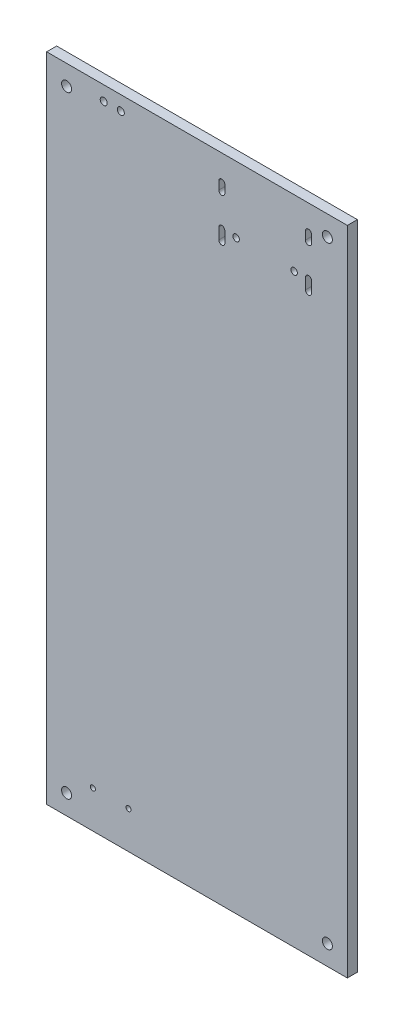
ISO-10303-21;
HEADER;
FILE_DESCRIPTION(('STEP AP214'),'2;1');
FILE_NAME('part.step','',(''),(''),'','','');
FILE_SCHEMA(('AUTOMOTIVE_DESIGN { 1 0 10303 214 1 1 1 1 }'));
ENDSEC;
DATA;
#1=APPLICATION_CONTEXT('core data for automotive mechanical design processes');
#2=APPLICATION_PROTOCOL_DEFINITION('international standard','automotive_design',2000,#1);
#3=PRODUCT_CONTEXT('',#1,'mechanical');
#4=PRODUCT('Part','Part','',(#3));
#5=PRODUCT_RELATED_PRODUCT_CATEGORY('part','',(#4));
#6=PRODUCT_DEFINITION_FORMATION('','',#4);
#7=PRODUCT_DEFINITION_CONTEXT('part definition',#1,'design');
#8=PRODUCT_DEFINITION('design','',#6,#7);
#9=PRODUCT_DEFINITION_SHAPE('','',#8);
#10=(LENGTH_UNIT() NAMED_UNIT(*) SI_UNIT(.MILLI.,.METRE.));
#11=(NAMED_UNIT(*) PLANE_ANGLE_UNIT() SI_UNIT($,.RADIAN.));
#12=(NAMED_UNIT(*) SI_UNIT($,.STERADIAN.) SOLID_ANGLE_UNIT());
#13=UNCERTAINTY_MEASURE_WITH_UNIT(LENGTH_MEASURE(1.E-05),#10,'distance_accuracy_value','');
#14=(GEOMETRIC_REPRESENTATION_CONTEXT(3) GLOBAL_UNCERTAINTY_ASSIGNED_CONTEXT((#13)) GLOBAL_UNIT_ASSIGNED_CONTEXT((#10,
#11,#12)) REPRESENTATION_CONTEXT('',''));
#15=CARTESIAN_POINT('',(0.,0.,0.));
#16=DIRECTION('',(0.,0.,1.));
#17=DIRECTION('',(1.,0.,0.));
#18=AXIS2_PLACEMENT_3D('',#15,#16,#17);
#19=CARTESIAN_POINT('',(15.050830581661,-32.50006477013,0.));
#20=DIRECTION('',(0.,0.,-1.));
#21=DIRECTION('',(-1.,0.,0.));
#22=AXIS2_PLACEMENT_3D('',#19,#20,#21);
#23=PLANE('',#22);
#24=CARTESIAN_POINT('',(28.050855981712,-63.00012700025,0.));
#25=DIRECTION('',(0.,0.,-1.));
#26=DIRECTION('',(-1.,0.,0.));
#27=AXIS2_PLACEMENT_3D('',#24,#25,#26);
#28=CIRCLE('',#27,0.5);
#29=CARTESIAN_POINT('',(27.550855981712,-63.00012700025,0.));
#30=VERTEX_POINT('',#29);
#31=EDGE_CURVE('E269',#30,#30,#28,.F.);
#32=ORIENTED_EDGE('',*,*,#31,.T.);
#33=EDGE_LOOP('',(#32));
#34=FACE_BOUND('',#33,.T.);
#35=CARTESIAN_POINT('',(28.050855981712,-2.00000508001,0.));
#36=DIRECTION('',(0.,0.,-1.));
#37=DIRECTION('',(-1.,0.,0.));
#38=AXIS2_PLACEMENT_3D('',#35,#36,#37);
#39=CIRCLE('',#38,0.5);
#40=CARTESIAN_POINT('',(27.550855981712,-2.00000508001,0.));
#41=VERTEX_POINT('',#40);
#42=EDGE_CURVE('E272',#41,#41,#39,.F.);
#43=ORIENTED_EDGE('',*,*,#42,.T.);
#44=EDGE_LOOP('',(#43));
#45=FACE_BOUND('',#44,.T.);
#46=DIRECTION('',(0.,1.,0.));
#47=VECTOR('',#46,1.);
#48=CARTESIAN_POINT('',(25.864084328169,-6.571399542799,0.));
#49=LINE('',#48,#47);
#50=CARTESIAN_POINT('',(25.864084328169,-7.67142494285,0.));
#51=VERTEX_POINT('',#50);
#52=CARTESIAN_POINT('',(25.864084328169,-6.571399542799,0.));
#53=VERTEX_POINT('',#52);
#54=EDGE_CURVE('E176',#51,#53,#49,.T.);
#55=ORIENTED_EDGE('',*,*,#54,.F.);
#56=CARTESIAN_POINT('',(26.164084328169,-7.67142494285,0.));
#57=DIRECTION('',(0.,0.,-1.));
#58=DIRECTION('',(-1.,0.,0.));
#59=AXIS2_PLACEMENT_3D('',#56,#57,#58);
#60=CIRCLE('',#59,0.3);
#61=CARTESIAN_POINT('',(26.464084328169,-7.67142494285,0.));
#62=VERTEX_POINT('',#61);
#63=EDGE_CURVE('E179',#51,#62,#60,.F.);
#64=ORIENTED_EDGE('',*,*,#63,.T.);
#65=DIRECTION('',(0.,1.,0.));
#66=VECTOR('',#65,1.);
#67=CARTESIAN_POINT('',(26.464084328169,-7.67142494285,0.));
#68=LINE('',#67,#66);
#69=CARTESIAN_POINT('',(26.464084328169,-6.571399542799,0.));
#70=VERTEX_POINT('',#69);
#71=EDGE_CURVE('E181',#70,#62,#68,.F.);
#72=ORIENTED_EDGE('',*,*,#71,.F.);
#73=CARTESIAN_POINT('',(26.164084328169,-6.571399542799,0.));
#74=DIRECTION('',(0.,0.,-1.));
#75=DIRECTION('',(-1.,0.,0.));
#76=AXIS2_PLACEMENT_3D('',#73,#74,#75);
#77=CIRCLE('',#76,0.3);
#78=EDGE_CURVE('E183',#70,#53,#77,.F.);
#79=ORIENTED_EDGE('',*,*,#78,.T.);
#80=EDGE_LOOP('',(#55,#64,#72,#79));
#81=FACE_BOUND('',#80,.T.);
#82=DIRECTION('',(0.,1.,0.));
#83=VECTOR('',#82,1.);
#84=CARTESIAN_POINT('',(25.864084328169,-2.571551943104,0.));
#85=LINE('',#84,#83);
#86=CARTESIAN_POINT('',(25.864084328169,-3.371551943104,0.));
#87=VERTEX_POINT('',#86);
#88=CARTESIAN_POINT('',(25.864084328169,-2.571551943104,0.));
#89=VERTEX_POINT('',#88);
#90=EDGE_CURVE('E185',#87,#89,#85,.T.);
#91=ORIENTED_EDGE('',*,*,#90,.F.);
#92=CARTESIAN_POINT('',(26.164084328169,-3.371551943104,0.));
#93=DIRECTION('',(0.,0.,-1.));
#94=DIRECTION('',(-1.,0.,0.));
#95=AXIS2_PLACEMENT_3D('',#92,#93,#94);
#96=CIRCLE('',#95,0.3);
#97=CARTESIAN_POINT('',(26.464084328169,-3.371551943104,0.));
#98=VERTEX_POINT('',#97);
#99=EDGE_CURVE('E188',#87,#98,#96,.F.);
#100=ORIENTED_EDGE('',*,*,#99,.T.);
#101=DIRECTION('',(0.,1.,0.));
#102=VECTOR('',#101,1.);
#103=CARTESIAN_POINT('',(26.464084328169,-3.371551943104,0.));
#104=LINE('',#103,#102);
#105=CARTESIAN_POINT('',(26.464084328169,-2.571551943104,0.));
#106=VERTEX_POINT('',#105);
#107=EDGE_CURVE('E190',#106,#98,#104,.F.);
#108=ORIENTED_EDGE('',*,*,#107,.F.);
#109=CARTESIAN_POINT('',(26.164084328169,-2.571551943104,0.));
#110=DIRECTION('',(0.,0.,-1.));
#111=DIRECTION('',(-1.,0.,0.));
#112=AXIS2_PLACEMENT_3D('',#109,#110,#111);
#113=CIRCLE('',#112,0.3);
#114=EDGE_CURVE('E192',#106,#89,#113,.F.);
#115=ORIENTED_EDGE('',*,*,#114,.T.);
#116=EDGE_LOOP('',(#91,#100,#108,#115));
#117=FACE_BOUND('',#116,.T.);
#118=CARTESIAN_POINT('',(24.734061468123,-6.622047244094,0.));
#119=DIRECTION('',(0.,0.,-1.));
#120=DIRECTION('',(-1.,0.,0.));
#121=AXIS2_PLACEMENT_3D('',#118,#119,#120);
#122=CIRCLE('',#121,0.324993649987);
#123=CARTESIAN_POINT('',(24.409067818136,-6.622047244094,0.));
#124=VERTEX_POINT('',#123);
#125=EDGE_CURVE('E193',#124,#124,#122,.F.);
#126=ORIENTED_EDGE('',*,*,#125,.T.);
#127=EDGE_LOOP('',(#126));
#128=FACE_BOUND('',#127,.T.);
#129=CARTESIAN_POINT('',(18.954025908052,-6.622047244094,0.));
#130=DIRECTION('',(0.,0.,-1.));
#131=DIRECTION('',(-1.,0.,0.));
#132=AXIS2_PLACEMENT_3D('',#129,#130,#131);
#133=CIRCLE('',#132,0.324993649987);
#134=CARTESIAN_POINT('',(18.629032258065,-6.622047244094,0.));
#135=VERTEX_POINT('',#134);
#136=EDGE_CURVE('E287',#135,#135,#133,.F.);
#137=ORIENTED_EDGE('',*,*,#136,.T.);
#138=EDGE_LOOP('',(#137));
#139=FACE_BOUND('',#138,.T.);
#140=DIRECTION('',(0.,1.,0.));
#141=VECTOR('',#140,1.);
#142=CARTESIAN_POINT('',(17.224003048006,-6.571399542799,0.));
#143=LINE('',#142,#141);
#144=CARTESIAN_POINT('',(17.224003048006,-7.67142494285,0.));
#145=VERTEX_POINT('',#144);
#146=CARTESIAN_POINT('',(17.224003048006,-6.571399542799,0.));
#147=VERTEX_POINT('',#146);
#148=EDGE_CURVE('E194',#145,#147,#143,.T.);
#149=ORIENTED_EDGE('',*,*,#148,.F.);
#150=CARTESIAN_POINT('',(17.524003048006,-7.67142494285,0.));
#151=DIRECTION('',(0.,0.,-1.));
#152=DIRECTION('',(-1.,0.,0.));
#153=AXIS2_PLACEMENT_3D('',#150,#151,#152);
#154=CIRCLE('',#153,0.3);
#155=CARTESIAN_POINT('',(17.824003048006,-7.67142494285,0.));
#156=VERTEX_POINT('',#155);
#157=EDGE_CURVE('E197',#145,#156,#154,.F.);
#158=ORIENTED_EDGE('',*,*,#157,.T.);
#159=DIRECTION('',(0.,1.,0.));
#160=VECTOR('',#159,1.);
#161=CARTESIAN_POINT('',(17.824003048006,-7.67142494285,0.));
#162=LINE('',#161,#160);
#163=CARTESIAN_POINT('',(17.824003048006,-6.571399542799,0.));
#164=VERTEX_POINT('',#163);
#165=EDGE_CURVE('E199',#164,#156,#162,.F.);
#166=ORIENTED_EDGE('',*,*,#165,.F.);
#167=CARTESIAN_POINT('',(17.524003048006,-6.571399542799,0.));
#168=DIRECTION('',(0.,0.,-1.));
#169=DIRECTION('',(-1.,0.,0.));
#170=AXIS2_PLACEMENT_3D('',#167,#168,#169);
#171=CIRCLE('',#170,0.3);
#172=EDGE_CURVE('E201',#164,#147,#171,.F.);
#173=ORIENTED_EDGE('',*,*,#172,.T.);
#174=EDGE_LOOP('',(#149,#158,#166,#173));
#175=FACE_BOUND('',#174,.T.);
#176=DIRECTION('',(0.,1.,0.));
#177=VECTOR('',#176,1.);
#178=CARTESIAN_POINT('',(17.224003048006,-2.571551943104,0.));
#179=LINE('',#178,#177);
#180=CARTESIAN_POINT('',(17.224003048006,-3.371551943104,0.));
#181=VERTEX_POINT('',#180);
#182=CARTESIAN_POINT('',(17.224003048006,-2.571551943104,0.));
#183=VERTEX_POINT('',#182);
#184=EDGE_CURVE('E203',#181,#183,#179,.T.);
#185=ORIENTED_EDGE('',*,*,#184,.F.);
#186=CARTESIAN_POINT('',(17.524003048006,-3.371551943104,0.));
#187=DIRECTION('',(0.,0.,-1.));
#188=DIRECTION('',(-1.,0.,0.));
#189=AXIS2_PLACEMENT_3D('',#186,#187,#188);
#190=CIRCLE('',#189,0.3);
#191=CARTESIAN_POINT('',(17.824003048006,-3.371551943104,0.));
#192=VERTEX_POINT('',#191);
#193=EDGE_CURVE('E206',#181,#192,#190,.F.);
#194=ORIENTED_EDGE('',*,*,#193,.T.);
#195=DIRECTION('',(0.,1.,0.));
#196=VECTOR('',#195,1.);
#197=CARTESIAN_POINT('',(17.824003048006,-3.371551943104,0.));
#198=LINE('',#197,#196);
#199=CARTESIAN_POINT('',(17.824003048006,-2.571551943104,0.));
#200=VERTEX_POINT('',#199);
#201=EDGE_CURVE('E208',#200,#192,#198,.F.);
#202=ORIENTED_EDGE('',*,*,#201,.F.);
#203=CARTESIAN_POINT('',(17.524003048006,-2.571551943104,0.));
#204=DIRECTION('',(0.,0.,-1.));
#205=DIRECTION('',(-1.,0.,0.));
#206=AXIS2_PLACEMENT_3D('',#203,#204,#205);
#207=CIRCLE('',#206,0.3);
#208=EDGE_CURVE('E133',#200,#183,#207,.F.);
#209=ORIENTED_EDGE('',*,*,#208,.T.);
#210=EDGE_LOOP('',(#185,#194,#202,#209));
#211=FACE_BOUND('',#210,.T.);
#212=CARTESIAN_POINT('',(8.229616459233,-61.26492252984,0.));
#213=DIRECTION('',(0.,0.,-1.));
#214=DIRECTION('',(-1.,0.,0.));
#215=AXIS2_PLACEMENT_3D('',#212,#213,#214);
#216=CIRCLE('',#215,0.25);
#217=CARTESIAN_POINT('',(7.979616459233,-61.26492252984,0.));
#218=VERTEX_POINT('',#217);
#219=EDGE_CURVE('E209',#218,#218,#216,.F.);
#220=ORIENTED_EDGE('',*,*,#219,.T.);
#221=EDGE_LOOP('',(#220));
#222=FACE_BOUND('',#221,.T.);
#223=CARTESIAN_POINT('',(7.454152908306,-1.44475488951,0.));
#224=DIRECTION('',(0.,0.,-1.));
#225=DIRECTION('',(-1.,0.,0.));
#226=AXIS2_PLACEMENT_3D('',#223,#224,#225);
#227=CIRCLE('',#226,0.350012700025);
#228=CARTESIAN_POINT('',(7.104140208281,-1.44475488951,0.));
#229=VERTEX_POINT('',#228);
#230=EDGE_CURVE('E303',#229,#229,#227,.F.);
#231=ORIENTED_EDGE('',*,*,#230,.T.);
#232=EDGE_LOOP('',(#231));
#233=FACE_BOUND('',#232,.T.);
#234=CARTESIAN_POINT('',(5.754127508255,-1.44475488951,0.));
#235=DIRECTION('',(0.,0.,-1.));
#236=DIRECTION('',(-1.,0.,0.));
#237=AXIS2_PLACEMENT_3D('',#234,#235,#236);
#238=CIRCLE('',#237,0.350012700025);
#239=CARTESIAN_POINT('',(5.40411480823,-1.44475488951,0.));
#240=VERTEX_POINT('',#239);
#241=EDGE_CURVE('E306',#240,#240,#238,.F.);
#242=ORIENTED_EDGE('',*,*,#241,.T.);
#243=EDGE_LOOP('',(#242));
#244=FACE_BOUND('',#243,.T.);
#245=CARTESIAN_POINT('',(4.673609347219,-61.26492252984,0.));
#246=DIRECTION('',(0.,0.,-1.));
#247=DIRECTION('',(-1.,0.,0.));
#248=AXIS2_PLACEMENT_3D('',#245,#246,#247);
#249=CIRCLE('',#248,0.25);
#250=CARTESIAN_POINT('',(4.423609347219,-61.26492252984,0.));
#251=VERTEX_POINT('',#250);
#252=EDGE_CURVE('E309',#251,#251,#249,.F.);
#253=ORIENTED_EDGE('',*,*,#252,.T.);
#254=EDGE_LOOP('',(#253));
#255=FACE_BOUND('',#254,.T.);
#256=CARTESIAN_POINT('',(2.05080518161,-2.00000508001,0.));
#257=DIRECTION('',(0.,0.,-1.));
#258=DIRECTION('',(-1.,0.,0.));
#259=AXIS2_PLACEMENT_3D('',#256,#257,#258);
#260=CIRCLE('',#259,0.5);
#261=CARTESIAN_POINT('',(1.55080518161,-2.00000508001,0.));
#262=VERTEX_POINT('',#261);
#263=EDGE_CURVE('E311',#262,#262,#260,.F.);
#264=ORIENTED_EDGE('',*,*,#263,.T.);
#265=EDGE_LOOP('',(#264));
#266=FACE_BOUND('',#265,.T.);
#267=CARTESIAN_POINT('',(2.05080518161,-63.00012700025,0.));
#268=DIRECTION('',(0.,0.,-1.));
#269=DIRECTION('',(-1.,0.,0.));
#270=AXIS2_PLACEMENT_3D('',#267,#268,#269);
#271=CIRCLE('',#270,0.5);
#272=CARTESIAN_POINT('',(1.55080518161,-63.00012700025,0.));
#273=VERTEX_POINT('',#272);
#274=EDGE_CURVE('E20',#273,#273,#271,.F.);
#275=ORIENTED_EDGE('',*,*,#274,.T.);
#276=EDGE_LOOP('',(#275));
#277=FACE_BOUND('',#276,.T.);
#278=DIRECTION('',(1.,0.,0.));
#279=VECTOR('',#278,1.);
#280=CARTESIAN_POINT('',(30.038161036322,-64.98742951485,0.));
#281=LINE('',#280,#279);
#282=CARTESIAN_POINT('',(0.0635001270002508,-64.98742951485,0.));
#283=VERTEX_POINT('',#282);
#284=CARTESIAN_POINT('',(30.038161036322,-64.98742951485,0.));
#285=VERTEX_POINT('',#284);
#286=EDGE_CURVE('E329',#283,#285,#281,.T.);
#287=ORIENTED_EDGE('',*,*,#286,.F.);
#288=DIRECTION('',(0.,-1.,0.));
#289=VECTOR('',#288,1.);
#290=CARTESIAN_POINT('',(0.06350012700025,-64.98742951485,0.));
#291=LINE('',#290,#289);
#292=CARTESIAN_POINT('',(0.0635001270002564,-0.0127000254000488,0.));
#293=VERTEX_POINT('',#292);
#294=EDGE_CURVE('E157',#293,#283,#291,.T.);
#295=ORIENTED_EDGE('',*,*,#294,.F.);
#296=DIRECTION('',(1.,0.,0.));
#297=VECTOR('',#296,1.);
#298=CARTESIAN_POINT('',(0.06350012700026,-0.01270002540005,0.));
#299=LINE('',#298,#297);
#300=CARTESIAN_POINT('',(30.038161036322,-0.0127000254000494,0.));
#301=VERTEX_POINT('',#300);
#302=EDGE_CURVE('E142',#301,#293,#299,.F.);
#303=ORIENTED_EDGE('',*,*,#302,.F.);
#304=DIRECTION('',(0.,1.,0.));
#305=VECTOR('',#304,1.);
#306=CARTESIAN_POINT('',(30.038161036322,-0.01270002540005,0.));
#307=LINE('',#306,#305);
#308=EDGE_CURVE('E153',#285,#301,#307,.T.);
#309=ORIENTED_EDGE('',*,*,#308,.F.);
#310=EDGE_LOOP('',(#287,#295,#303,#309));
#311=FACE_BOUND('',#310,.T.);
#312=ADVANCED_FACE('F17',(#34,#45,#81,#117,#128,#139,#175,#211,#222,#233,#244,#255,#266,#277,
#311),#23,.T.);
#313=CARTESIAN_POINT('',(0.06350012700026,-0.01270002540005,0.));
#314=DIRECTION('',(0.,1.,0.));
#315=DIRECTION('',(0.,0.,1.));
#316=AXIS2_PLACEMENT_3D('',#313,#314,#315);
#317=PLANE('',#316);
#318=DIRECTION('',(0.,0.,1.));
#319=VECTOR('',#318,1.);
#320=CARTESIAN_POINT('',(30.038161036322,-0.01270002540005,0.));
#321=LINE('',#320,#319);
#322=CARTESIAN_POINT('',(30.038161036322,-0.0127000254000494,1.000025400051));
#323=VERTEX_POINT('',#322);
#324=EDGE_CURVE('E158',#301,#323,#321,.T.);
#325=ORIENTED_EDGE('',*,*,#324,.F.);
#326=ORIENTED_EDGE('',*,*,#302,.T.);
#327=DIRECTION('',(0.,0.,1.));
#328=VECTOR('',#327,1.);
#329=CARTESIAN_POINT('',(0.0635001270002558,-0.0127000254000476,0.));
#330=LINE('',#329,#328);
#331=CARTESIAN_POINT('',(0.0635001270002564,-0.0127000254000488,1.000025400051));
#332=VERTEX_POINT('',#331);
#333=EDGE_CURVE('E318',#332,#293,#330,.F.);
#334=ORIENTED_EDGE('',*,*,#333,.F.);
#335=DIRECTION('',(-1.,0.,0.));
#336=VECTOR('',#335,1.);
#337=CARTESIAN_POINT('',(15.050830581661,-0.0127000254000476,1.000025400051));
#338=LINE('',#337,#336);
#339=EDGE_CURVE('E172',#332,#323,#338,.F.);
#340=ORIENTED_EDGE('',*,*,#339,.T.);
#341=EDGE_LOOP('',(#325,#326,#334,#340));
#342=FACE_BOUND('',#341,.T.);
#343=ADVANCED_FACE('F170',(#342),#317,.T.);
#344=CARTESIAN_POINT('',(30.038161036322,-0.01270002540005,0.));
#345=DIRECTION('',(1.,0.,0.));
#346=DIRECTION('',(0.,1.,0.));
#347=AXIS2_PLACEMENT_3D('',#344,#345,#346);
#348=PLANE('',#347);
#349=DIRECTION('',(0.,0.,-1.));
#350=VECTOR('',#349,1.);
#351=CARTESIAN_POINT('',(30.038161036322,-64.98742951485,0.));
#352=LINE('',#351,#350);
#353=CARTESIAN_POINT('',(30.038161036322,-64.98742951485,1.000025400051));
#354=VERTEX_POINT('',#353);
#355=EDGE_CURVE('E167',#285,#354,#352,.F.);
#356=ORIENTED_EDGE('',*,*,#355,.F.);
#357=ORIENTED_EDGE('',*,*,#308,.T.);
#358=ORIENTED_EDGE('',*,*,#324,.T.);
#359=DIRECTION('',(0.,1.,0.));
#360=VECTOR('',#359,1.);
#361=CARTESIAN_POINT('',(30.038161036322,-32.50006477013,1.000025400051));
#362=LINE('',#361,#360);
#363=EDGE_CURVE('E340',#323,#354,#362,.F.);
#364=ORIENTED_EDGE('',*,*,#363,.T.);
#365=EDGE_LOOP('',(#356,#357,#358,#364));
#366=FACE_BOUND('',#365,.T.);
#367=ADVANCED_FACE('F163',(#366),#348,.T.);
#368=CARTESIAN_POINT('',(30.038161036322,-64.98742951485,0.));
#369=DIRECTION('',(0.,-1.,0.));
#370=DIRECTION('',(0.,0.,-1.));
#371=AXIS2_PLACEMENT_3D('',#368,#369,#370);
#372=PLANE('',#371);
#373=DIRECTION('',(0.,0.,1.));
#374=VECTOR('',#373,1.);
#375=CARTESIAN_POINT('',(0.06350012700025,-64.98742951485,0.));
#376=LINE('',#375,#374);
#377=CARTESIAN_POINT('',(0.0635001270002508,-64.98742951485,1.000025400051));
#378=VERTEX_POINT('',#377);
#379=EDGE_CURVE('E323',#283,#378,#376,.T.);
#380=ORIENTED_EDGE('',*,*,#379,.F.);
#381=ORIENTED_EDGE('',*,*,#286,.T.);
#382=ORIENTED_EDGE('',*,*,#355,.T.);
#383=DIRECTION('',(-1.,0.,0.));
#384=VECTOR('',#383,1.);
#385=CARTESIAN_POINT('',(15.050830581661,-64.98742951485,1.000025400051));
#386=LINE('',#385,#384);
#387=EDGE_CURVE('E335',#354,#378,#386,.T.);
#388=ORIENTED_EDGE('',*,*,#387,.T.);
#389=EDGE_LOOP('',(#380,#381,#382,#388));
#390=FACE_BOUND('',#389,.T.);
#391=ADVANCED_FACE('F334',(#390),#372,.T.);
#392=CARTESIAN_POINT('',(0.06350012700025,-64.98742951485,0.));
#393=DIRECTION('',(-1.,0.,0.));
#394=DIRECTION('',(0.,-1.,0.));
#395=AXIS2_PLACEMENT_3D('',#392,#393,#394);
#396=PLANE('',#395);
#397=ORIENTED_EDGE('',*,*,#333,.T.);
#398=ORIENTED_EDGE('',*,*,#294,.T.);
#399=ORIENTED_EDGE('',*,*,#379,.T.);
#400=DIRECTION('',(0.,1.,0.));
#401=VECTOR('',#400,1.);
#402=CARTESIAN_POINT('',(0.0635001270002499,-32.50006477013,1.000025400051));
#403=LINE('',#402,#401);
#404=EDGE_CURVE('E268',#378,#332,#403,.T.);
#405=ORIENTED_EDGE('',*,*,#404,.T.);
#406=EDGE_LOOP('',(#397,#398,#399,#405));
#407=FACE_BOUND('',#406,.T.);
#408=ADVANCED_FACE('F387',(#407),#396,.T.);
#409=CARTESIAN_POINT('',(2.05080518161,-63.00012700025,0.));
#410=DIRECTION('',(0.,0.,-1.));
#411=DIRECTION('',(-1.,0.,0.));
#412=AXIS2_PLACEMENT_3D('',#409,#410,#411);
#413=CYLINDRICAL_SURFACE('',#412,0.5);
#414=CARTESIAN_POINT('',(2.05080518161,-63.00012700025,1.000025400051));
#415=DIRECTION('',(0.,0.,-1.));
#416=DIRECTION('',(-1.,0.,0.));
#417=AXIS2_PLACEMENT_3D('',#414,#415,#416);
#418=CIRCLE('',#417,0.5);
#419=CARTESIAN_POINT('',(1.55080518161,-63.00012700025,1.000025400051));
#420=VERTEX_POINT('',#419);
#421=EDGE_CURVE('E265',#420,#420,#418,.F.);
#422=ORIENTED_EDGE('',*,*,#421,.T.);
#423=EDGE_LOOP('',(#422));
#424=FACE_BOUND('',#423,.T.);
#425=ORIENTED_EDGE('',*,*,#274,.F.);
#426=EDGE_LOOP('',(#425));
#427=FACE_BOUND('',#426,.T.);
#428=ADVANCED_FACE('F390',(#424,#427),#413,.F.);
#429=CARTESIAN_POINT('',(2.05080518161,-2.00000508001,0.));
#430=DIRECTION('',(0.,0.,-1.));
#431=DIRECTION('',(-1.,0.,0.));
#432=AXIS2_PLACEMENT_3D('',#429,#430,#431);
#433=CYLINDRICAL_SURFACE('',#432,0.5);
#434=CARTESIAN_POINT('',(2.05080518161,-2.00000508001,1.000025400051));
#435=DIRECTION('',(0.,0.,-1.));
#436=DIRECTION('',(-1.,0.,0.));
#437=AXIS2_PLACEMENT_3D('',#434,#435,#436);
#438=CIRCLE('',#437,0.5);
#439=CARTESIAN_POINT('',(1.55080518161,-2.00000508001,1.000025400051));
#440=VERTEX_POINT('',#439);
#441=EDGE_CURVE('E262',#440,#440,#438,.F.);
#442=ORIENTED_EDGE('',*,*,#441,.T.);
#443=EDGE_LOOP('',(#442));
#444=FACE_BOUND('',#443,.T.);
#445=ORIENTED_EDGE('',*,*,#263,.F.);
#446=EDGE_LOOP('',(#445));
#447=FACE_BOUND('',#446,.T.);
#448=ADVANCED_FACE('F397',(#444,#447),#433,.F.);
#449=CARTESIAN_POINT('',(4.673609347219,-61.26492252984,0.));
#450=DIRECTION('',(0.,0.,-1.));
#451=DIRECTION('',(-1.,0.,0.));
#452=AXIS2_PLACEMENT_3D('',#449,#450,#451);
#453=CYLINDRICAL_SURFACE('',#452,0.25);
#454=CARTESIAN_POINT('',(4.673609347219,-61.26492252984,1.000025400051));
#455=DIRECTION('',(0.,0.,-1.));
#456=DIRECTION('',(-1.,0.,0.));
#457=AXIS2_PLACEMENT_3D('',#454,#455,#456);
#458=CIRCLE('',#457,0.25);
#459=CARTESIAN_POINT('',(4.423609347219,-61.26492252984,1.000025400051));
#460=VERTEX_POINT('',#459);
#461=EDGE_CURVE('E259',#460,#460,#458,.F.);
#462=ORIENTED_EDGE('',*,*,#461,.T.);
#463=EDGE_LOOP('',(#462));
#464=FACE_BOUND('',#463,.T.);
#465=ORIENTED_EDGE('',*,*,#252,.F.);
#466=EDGE_LOOP('',(#465));
#467=FACE_BOUND('',#466,.T.);
#468=ADVANCED_FACE('F494',(#464,#467),#453,.F.);
#469=CARTESIAN_POINT('',(5.754127508255,-1.44475488951,0.));
#470=DIRECTION('',(0.,0.,-1.));
#471=DIRECTION('',(-1.,0.,0.));
#472=AXIS2_PLACEMENT_3D('',#469,#470,#471);
#473=CYLINDRICAL_SURFACE('',#472,0.350012700025);
#474=CARTESIAN_POINT('',(5.754127508255,-1.44475488951,1.000025400051));
#475=DIRECTION('',(0.,0.,-1.));
#476=DIRECTION('',(-1.,0.,0.));
#477=AXIS2_PLACEMENT_3D('',#474,#475,#476);
#478=CIRCLE('',#477,0.350012700025);
#479=CARTESIAN_POINT('',(5.40411480823,-1.44475488951,1.000025400051));
#480=VERTEX_POINT('',#479);
#481=EDGE_CURVE('E256',#480,#480,#478,.F.);
#482=ORIENTED_EDGE('',*,*,#481,.T.);
#483=EDGE_LOOP('',(#482));
#484=FACE_BOUND('',#483,.T.);
#485=ORIENTED_EDGE('',*,*,#241,.F.);
#486=EDGE_LOOP('',(#485));
#487=FACE_BOUND('',#486,.T.);
#488=ADVANCED_FACE('F490',(#484,#487),#473,.F.);
#489=CARTESIAN_POINT('',(7.454152908306,-1.44475488951,0.));
#490=DIRECTION('',(0.,0.,-1.));
#491=DIRECTION('',(-1.,0.,0.));
#492=AXIS2_PLACEMENT_3D('',#489,#490,#491);
#493=CYLINDRICAL_SURFACE('',#492,0.350012700025);
#494=CARTESIAN_POINT('',(7.454152908306,-1.44475488951,1.000025400051));
#495=DIRECTION('',(0.,0.,-1.));
#496=DIRECTION('',(-1.,0.,0.));
#497=AXIS2_PLACEMENT_3D('',#494,#495,#496);
#498=CIRCLE('',#497,0.350012700025);
#499=CARTESIAN_POINT('',(7.104140208281,-1.44475488951,1.000025400051));
#500=VERTEX_POINT('',#499);
#501=EDGE_CURVE('E253',#500,#500,#498,.F.);
#502=ORIENTED_EDGE('',*,*,#501,.T.);
#503=EDGE_LOOP('',(#502));
#504=FACE_BOUND('',#503,.T.);
#505=ORIENTED_EDGE('',*,*,#230,.F.);
#506=EDGE_LOOP('',(#505));
#507=FACE_BOUND('',#506,.T.);
#508=ADVANCED_FACE('F486',(#504,#507),#493,.F.);
#509=CARTESIAN_POINT('',(8.229616459233,-61.26492252984,0.));
#510=DIRECTION('',(0.,0.,-1.));
#511=DIRECTION('',(-1.,0.,0.));
#512=AXIS2_PLACEMENT_3D('',#509,#510,#511);
#513=CYLINDRICAL_SURFACE('',#512,0.25);
#514=CARTESIAN_POINT('',(8.229616459233,-61.26492252984,1.000025400051));
#515=DIRECTION('',(0.,0.,-1.));
#516=DIRECTION('',(-1.,0.,0.));
#517=AXIS2_PLACEMENT_3D('',#514,#515,#516);
#518=CIRCLE('',#517,0.25);
#519=CARTESIAN_POINT('',(7.979616459233,-61.26492252984,1.000025400051));
#520=VERTEX_POINT('',#519);
#521=EDGE_CURVE('E250',#520,#520,#518,.F.);
#522=ORIENTED_EDGE('',*,*,#521,.T.);
#523=EDGE_LOOP('',(#522));
#524=FACE_BOUND('',#523,.T.);
#525=ORIENTED_EDGE('',*,*,#219,.F.);
#526=EDGE_LOOP('',(#525));
#527=FACE_BOUND('',#526,.T.);
#528=ADVANCED_FACE('F483',(#524,#527),#513,.F.);
#529=CARTESIAN_POINT('',(17.824003048006,-3.371551943104,0.));
#530=DIRECTION('',(-1.,0.,0.));
#531=DIRECTION('',(0.,0.,1.));
#532=AXIS2_PLACEMENT_3D('',#529,#530,#531);
#533=PLANE('',#532);
#534=DIRECTION('',(0.,0.,-1.));
#535=VECTOR('',#534,1.);
#536=CARTESIAN_POINT('',(17.824003048006,-2.571551943104,0.));
#537=LINE('',#536,#535);
#538=CARTESIAN_POINT('',(17.824003048006,-2.571551943104,1.000025400051));
#539=VERTEX_POINT('',#538);
#540=EDGE_CURVE('E300',#539,#200,#537,.T.);
#541=ORIENTED_EDGE('',*,*,#540,.T.);
#542=ORIENTED_EDGE('',*,*,#201,.T.);
#543=DIRECTION('',(0.,0.,-1.));
#544=VECTOR('',#543,1.);
#545=CARTESIAN_POINT('',(17.824003048006,-3.371551943104,0.));
#546=LINE('',#545,#544);
#547=CARTESIAN_POINT('',(17.824003048006,-3.371551943104,1.000025400051));
#548=VERTEX_POINT('',#547);
#549=EDGE_CURVE('E298',#192,#548,#546,.F.);
#550=ORIENTED_EDGE('',*,*,#549,.T.);
#551=DIRECTION('',(0.,1.,0.));
#552=VECTOR('',#551,1.);
#553=CARTESIAN_POINT('',(17.824003048006,-32.50006477013,1.000025400051));
#554=LINE('',#553,#552);
#555=EDGE_CURVE('E249',#548,#539,#554,.T.);
#556=ORIENTED_EDGE('',*,*,#555,.T.);
#557=EDGE_LOOP('',(#541,#542,#550,#556));
#558=FACE_BOUND('',#557,.T.);
#559=ADVANCED_FACE('F376',(#558),#533,.T.);
#560=CARTESIAN_POINT('',(17.524003048006,-2.571551943104,0.));
#561=DIRECTION('',(0.,0.,-1.));
#562=DIRECTION('',(-1.,0.,0.));
#563=AXIS2_PLACEMENT_3D('',#560,#561,#562);
#564=CYLINDRICAL_SURFACE('',#563,0.3);
#565=CARTESIAN_POINT('',(17.524003048006,-2.571551943104,1.000025400051));
#566=DIRECTION('',(0.,0.,-1.));
#567=DIRECTION('',(-1.,0.,0.));
#568=AXIS2_PLACEMENT_3D('',#565,#566,#567);
#569=CIRCLE('',#568,0.3);
#570=CARTESIAN_POINT('',(17.224003048006,-2.571551943104,1.000025400051));
#571=VERTEX_POINT('',#570);
#572=EDGE_CURVE('E246',#539,#571,#569,.F.);
#573=ORIENTED_EDGE('',*,*,#572,.T.);
#574=DIRECTION('',(0.,0.,-1.));
#575=VECTOR('',#574,1.);
#576=CARTESIAN_POINT('',(17.224003048006,-2.571551943104,0.));
#577=LINE('',#576,#575);
#578=EDGE_CURVE('E207',#183,#571,#577,.F.);
#579=ORIENTED_EDGE('',*,*,#578,.F.);
#580=ORIENTED_EDGE('',*,*,#208,.F.);
#581=ORIENTED_EDGE('',*,*,#540,.F.);
#582=EDGE_LOOP('',(#573,#579,#580,#581));
#583=FACE_BOUND('',#582,.T.);
#584=ADVANCED_FACE('F379',(#583),#564,.F.);
#585=CARTESIAN_POINT('',(17.224003048006,-2.571551943104,0.));
#586=DIRECTION('',(1.,0.,0.));
#587=DIRECTION('',(0.,0.,-1.));
#588=AXIS2_PLACEMENT_3D('',#585,#586,#587);
#589=PLANE('',#588);
#590=DIRECTION('',(0.,0.,-1.));
#591=VECTOR('',#590,1.);
#592=CARTESIAN_POINT('',(17.224003048006,-3.371551943104,0.));
#593=LINE('',#592,#591);
#594=CARTESIAN_POINT('',(17.224003048006,-3.371551943104,1.000025400051));
#595=VERTEX_POINT('',#594);
#596=EDGE_CURVE('E202',#595,#181,#593,.T.);
#597=ORIENTED_EDGE('',*,*,#596,.T.);
#598=ORIENTED_EDGE('',*,*,#184,.T.);
#599=ORIENTED_EDGE('',*,*,#578,.T.);
#600=DIRECTION('',(0.,1.,0.));
#601=VECTOR('',#600,1.);
#602=CARTESIAN_POINT('',(17.224003048006,-32.50006477013,1.000025400051));
#603=LINE('',#602,#601);
#604=EDGE_CURVE('E245',#571,#595,#603,.F.);
#605=ORIENTED_EDGE('',*,*,#604,.T.);
#606=EDGE_LOOP('',(#597,#598,#599,#605));
#607=FACE_BOUND('',#606,.T.);
#608=ADVANCED_FACE('F475',(#607),#589,.T.);
#609=CARTESIAN_POINT('',(17.524003048006,-3.371551943104,0.));
#610=DIRECTION('',(0.,0.,-1.));
#611=DIRECTION('',(-1.,0.,0.));
#612=AXIS2_PLACEMENT_3D('',#609,#610,#611);
#613=CYLINDRICAL_SURFACE('',#612,0.3);
#614=CARTESIAN_POINT('',(17.524003048006,-3.371551943104,1.000025400051));
#615=DIRECTION('',(0.,0.,-1.));
#616=DIRECTION('',(-1.,0.,0.));
#617=AXIS2_PLACEMENT_3D('',#614,#615,#616);
#618=CIRCLE('',#617,0.3);
#619=EDGE_CURVE('E242',#595,#548,#618,.F.);
#620=ORIENTED_EDGE('',*,*,#619,.T.);
#621=ORIENTED_EDGE('',*,*,#549,.F.);
#622=ORIENTED_EDGE('',*,*,#193,.F.);
#623=ORIENTED_EDGE('',*,*,#596,.F.);
#624=EDGE_LOOP('',(#620,#621,#622,#623));
#625=FACE_BOUND('',#624,.T.);
#626=ADVANCED_FACE('F471',(#625),#613,.F.);
#627=CARTESIAN_POINT('',(17.824003048006,-7.67142494285,0.));
#628=DIRECTION('',(-1.,0.,0.));
#629=DIRECTION('',(0.,0.,1.));
#630=AXIS2_PLACEMENT_3D('',#627,#628,#629);
#631=PLANE('',#630);
#632=DIRECTION('',(0.,0.,-1.));
#633=VECTOR('',#632,1.);
#634=CARTESIAN_POINT('',(17.824003048006,-6.571399542799,0.));
#635=LINE('',#634,#633);
#636=CARTESIAN_POINT('',(17.824003048006,-6.571399542799,1.000025400051));
#637=VERTEX_POINT('',#636);
#638=EDGE_CURVE('E295',#637,#164,#635,.T.);
#639=ORIENTED_EDGE('',*,*,#638,.T.);
#640=ORIENTED_EDGE('',*,*,#165,.T.);
#641=DIRECTION('',(0.,0.,-1.));
#642=VECTOR('',#641,1.);
#643=CARTESIAN_POINT('',(17.824003048006,-7.67142494285,0.));
#644=LINE('',#643,#642);
#645=CARTESIAN_POINT('',(17.824003048006,-7.67142494285,1.000025400051));
#646=VERTEX_POINT('',#645);
#647=EDGE_CURVE('E293',#156,#646,#644,.F.);
#648=ORIENTED_EDGE('',*,*,#647,.T.);
#649=DIRECTION('',(0.,1.,0.));
#650=VECTOR('',#649,1.);
#651=CARTESIAN_POINT('',(17.824003048006,-32.50006477013,1.000025400051));
#652=LINE('',#651,#650);
#653=EDGE_CURVE('E241',#646,#637,#652,.T.);
#654=ORIENTED_EDGE('',*,*,#653,.T.);
#655=EDGE_LOOP('',(#639,#640,#648,#654));
#656=FACE_BOUND('',#655,.T.);
#657=ADVANCED_FACE('F467',(#656),#631,.T.);
#658=CARTESIAN_POINT('',(17.524003048006,-6.571399542799,0.));
#659=DIRECTION('',(0.,0.,-1.));
#660=DIRECTION('',(-1.,0.,0.));
#661=AXIS2_PLACEMENT_3D('',#658,#659,#660);
#662=CYLINDRICAL_SURFACE('',#661,0.3);
#663=CARTESIAN_POINT('',(17.524003048006,-6.571399542799,1.000025400051));
#664=DIRECTION('',(0.,0.,-1.));
#665=DIRECTION('',(-1.,0.,0.));
#666=AXIS2_PLACEMENT_3D('',#663,#664,#665);
#667=CIRCLE('',#666,0.3);
#668=CARTESIAN_POINT('',(17.224003048006,-6.571399542799,1.000025400051));
#669=VERTEX_POINT('',#668);
#670=EDGE_CURVE('E238',#637,#669,#667,.F.);
#671=ORIENTED_EDGE('',*,*,#670,.T.);
#672=DIRECTION('',(0.,0.,-1.));
#673=VECTOR('',#672,1.);
#674=CARTESIAN_POINT('',(17.224003048006,-6.571399542799,0.));
#675=LINE('',#674,#673);
#676=EDGE_CURVE('E198',#147,#669,#675,.F.);
#677=ORIENTED_EDGE('',*,*,#676,.F.);
#678=ORIENTED_EDGE('',*,*,#172,.F.);
#679=ORIENTED_EDGE('',*,*,#638,.F.);
#680=EDGE_LOOP('',(#671,#677,#678,#679));
#681=FACE_BOUND('',#680,.T.);
#682=ADVANCED_FACE('F463',(#681),#662,.F.);
#683=CARTESIAN_POINT('',(17.224003048006,-6.571399542799,0.));
#684=DIRECTION('',(1.,0.,0.));
#685=DIRECTION('',(0.,0.,-1.));
#686=AXIS2_PLACEMENT_3D('',#683,#684,#685);
#687=PLANE('',#686);
#688=DIRECTION('',(0.,0.,-1.));
#689=VECTOR('',#688,1.);
#690=CARTESIAN_POINT('',(17.224003048006,-7.67142494285,0.));
#691=LINE('',#690,#689);
#692=CARTESIAN_POINT('',(17.224003048006,-7.67142494285,1.000025400051));
#693=VERTEX_POINT('',#692);
#694=EDGE_CURVE('E290',#693,#145,#691,.T.);
#695=ORIENTED_EDGE('',*,*,#694,.T.);
#696=ORIENTED_EDGE('',*,*,#148,.T.);
#697=ORIENTED_EDGE('',*,*,#676,.T.);
#698=DIRECTION('',(0.,1.,0.));
#699=VECTOR('',#698,1.);
#700=CARTESIAN_POINT('',(17.224003048006,-32.50006477013,1.000025400051));
#701=LINE('',#700,#699);
#702=EDGE_CURVE('E237',#669,#693,#701,.F.);
#703=ORIENTED_EDGE('',*,*,#702,.T.);
#704=EDGE_LOOP('',(#695,#696,#697,#703));
#705=FACE_BOUND('',#704,.T.);
#706=ADVANCED_FACE('F459',(#705),#687,.T.);
#707=CARTESIAN_POINT('',(17.524003048006,-7.67142494285,0.));
#708=DIRECTION('',(0.,0.,-1.));
#709=DIRECTION('',(-1.,0.,0.));
#710=AXIS2_PLACEMENT_3D('',#707,#708,#709);
#711=CYLINDRICAL_SURFACE('',#710,0.3);
#712=CARTESIAN_POINT('',(17.524003048006,-7.67142494285,1.000025400051));
#713=DIRECTION('',(0.,0.,-1.));
#714=DIRECTION('',(-1.,0.,0.));
#715=AXIS2_PLACEMENT_3D('',#712,#713,#714);
#716=CIRCLE('',#715,0.3);
#717=EDGE_CURVE('E234',#693,#646,#716,.F.);
#718=ORIENTED_EDGE('',*,*,#717,.T.);
#719=ORIENTED_EDGE('',*,*,#647,.F.);
#720=ORIENTED_EDGE('',*,*,#157,.F.);
#721=ORIENTED_EDGE('',*,*,#694,.F.);
#722=EDGE_LOOP('',(#718,#719,#720,#721));
#723=FACE_BOUND('',#722,.T.);
#724=ADVANCED_FACE('F455',(#723),#711,.F.);
#725=CARTESIAN_POINT('',(18.954025908052,-6.622047244094,0.));
#726=DIRECTION('',(0.,0.,-1.));
#727=DIRECTION('',(-1.,0.,0.));
#728=AXIS2_PLACEMENT_3D('',#725,#726,#727);
#729=CYLINDRICAL_SURFACE('',#728,0.324993649987);
#730=CARTESIAN_POINT('',(18.954025908052,-6.622047244094,1.000025400051));
#731=DIRECTION('',(0.,0.,-1.));
#732=DIRECTION('',(-1.,0.,0.));
#733=AXIS2_PLACEMENT_3D('',#730,#731,#732);
#734=CIRCLE('',#733,0.324993649987);
#735=CARTESIAN_POINT('',(18.629032258065,-6.622047244094,1.000025400051));
#736=VERTEX_POINT('',#735);
#737=EDGE_CURVE('E231',#736,#736,#734,.F.);
#738=ORIENTED_EDGE('',*,*,#737,.T.);
#739=EDGE_LOOP('',(#738));
#740=FACE_BOUND('',#739,.T.);
#741=ORIENTED_EDGE('',*,*,#136,.F.);
#742=EDGE_LOOP('',(#741));
#743=FACE_BOUND('',#742,.T.);
#744=ADVANCED_FACE('F451',(#740,#743),#729,.F.);
#745=CARTESIAN_POINT('',(24.734061468123,-6.622047244094,0.));
#746=DIRECTION('',(0.,0.,-1.));
#747=DIRECTION('',(-1.,0.,0.));
#748=AXIS2_PLACEMENT_3D('',#745,#746,#747);
#749=CYLINDRICAL_SURFACE('',#748,0.324993649987);
#750=CARTESIAN_POINT('',(24.734061468123,-6.622047244094,1.000025400051));
#751=DIRECTION('',(0.,0.,-1.));
#752=DIRECTION('',(-1.,0.,0.));
#753=AXIS2_PLACEMENT_3D('',#750,#751,#752);
#754=CIRCLE('',#753,0.324993649987);
#755=CARTESIAN_POINT('',(24.409067818136,-6.622047244094,1.000025400051));
#756=VERTEX_POINT('',#755);
#757=EDGE_CURVE('E228',#756,#756,#754,.F.);
#758=ORIENTED_EDGE('',*,*,#757,.T.);
#759=EDGE_LOOP('',(#758));
#760=FACE_BOUND('',#759,.T.);
#761=ORIENTED_EDGE('',*,*,#125,.F.);
#762=EDGE_LOOP('',(#761));
#763=FACE_BOUND('',#762,.T.);
#764=ADVANCED_FACE('F447',(#760,#763),#749,.F.);
#765=CARTESIAN_POINT('',(26.464084328169,-3.371551943104,0.));
#766=DIRECTION('',(-1.,0.,0.));
#767=DIRECTION('',(0.,0.,1.));
#768=AXIS2_PLACEMENT_3D('',#765,#766,#767);
#769=PLANE('',#768);
#770=DIRECTION('',(0.,0.,-1.));
#771=VECTOR('',#770,1.);
#772=CARTESIAN_POINT('',(26.464084328169,-2.571551943104,0.));
#773=LINE('',#772,#771);
#774=CARTESIAN_POINT('',(26.464084328169,-2.571551943104,1.000025400051));
#775=VERTEX_POINT('',#774);
#776=EDGE_CURVE('E284',#775,#106,#773,.T.);
#777=ORIENTED_EDGE('',*,*,#776,.T.);
#778=ORIENTED_EDGE('',*,*,#107,.T.);
#779=DIRECTION('',(0.,0.,-1.));
#780=VECTOR('',#779,1.);
#781=CARTESIAN_POINT('',(26.464084328169,-3.371551943104,0.));
#782=LINE('',#781,#780);
#783=CARTESIAN_POINT('',(26.464084328169,-3.371551943104,1.000025400051));
#784=VERTEX_POINT('',#783);
#785=EDGE_CURVE('E282',#98,#784,#782,.F.);
#786=ORIENTED_EDGE('',*,*,#785,.T.);
#787=DIRECTION('',(0.,1.,0.));
#788=VECTOR('',#787,1.);
#789=CARTESIAN_POINT('',(26.464084328169,-32.50006477013,1.000025400051));
#790=LINE('',#789,#788);
#791=EDGE_CURVE('E227',#784,#775,#790,.T.);
#792=ORIENTED_EDGE('',*,*,#791,.T.);
#793=EDGE_LOOP('',(#777,#778,#786,#792));
#794=FACE_BOUND('',#793,.T.);
#795=ADVANCED_FACE('F443',(#794),#769,.T.);
#796=CARTESIAN_POINT('',(26.164084328169,-2.571551943104,0.));
#797=DIRECTION('',(0.,0.,-1.));
#798=DIRECTION('',(-1.,0.,0.));
#799=AXIS2_PLACEMENT_3D('',#796,#797,#798);
#800=CYLINDRICAL_SURFACE('',#799,0.3);
#801=CARTESIAN_POINT('',(26.164084328169,-2.571551943104,1.000025400051));
#802=DIRECTION('',(0.,0.,-1.));
#803=DIRECTION('',(-1.,0.,0.));
#804=AXIS2_PLACEMENT_3D('',#801,#802,#803);
#805=CIRCLE('',#804,0.3);
#806=CARTESIAN_POINT('',(25.864084328169,-2.571551943104,1.000025400051));
#807=VERTEX_POINT('',#806);
#808=EDGE_CURVE('E224',#775,#807,#805,.F.);
#809=ORIENTED_EDGE('',*,*,#808,.T.);
#810=DIRECTION('',(0.,0.,1.));
#811=VECTOR('',#810,1.);
#812=CARTESIAN_POINT('',(25.864084328169,-2.571551943104,0.));
#813=LINE('',#812,#811);
#814=EDGE_CURVE('E189',#89,#807,#813,.T.);
#815=ORIENTED_EDGE('',*,*,#814,.F.);
#816=ORIENTED_EDGE('',*,*,#114,.F.);
#817=ORIENTED_EDGE('',*,*,#776,.F.);
#818=EDGE_LOOP('',(#809,#815,#816,#817));
#819=FACE_BOUND('',#818,.T.);
#820=ADVANCED_FACE('F439',(#819),#800,.F.);
#821=CARTESIAN_POINT('',(25.864084328169,-2.571551943104,0.));
#822=DIRECTION('',(1.,0.,0.));
#823=DIRECTION('',(0.,1.,0.));
#824=AXIS2_PLACEMENT_3D('',#821,#822,#823);
#825=PLANE('',#824);
#826=DIRECTION('',(0.,0.,-1.));
#827=VECTOR('',#826,1.);
#828=CARTESIAN_POINT('',(25.864084328169,-3.371551943104,0.));
#829=LINE('',#828,#827);
#830=CARTESIAN_POINT('',(25.864084328169,-3.371551943104,1.000025400051));
#831=VERTEX_POINT('',#830);
#832=EDGE_CURVE('E184',#831,#87,#829,.T.);
#833=ORIENTED_EDGE('',*,*,#832,.T.);
#834=ORIENTED_EDGE('',*,*,#90,.T.);
#835=ORIENTED_EDGE('',*,*,#814,.T.);
#836=DIRECTION('',(0.,1.,0.));
#837=VECTOR('',#836,1.);
#838=CARTESIAN_POINT('',(25.864084328169,-32.50006477013,1.000025400051));
#839=LINE('',#838,#837);
#840=EDGE_CURVE('E223',#807,#831,#839,.F.);
#841=ORIENTED_EDGE('',*,*,#840,.T.);
#842=EDGE_LOOP('',(#833,#834,#835,#841));
#843=FACE_BOUND('',#842,.T.);
#844=ADVANCED_FACE('F435',(#843),#825,.T.);
#845=CARTESIAN_POINT('',(26.164084328169,-3.371551943104,0.));
#846=DIRECTION('',(0.,0.,-1.));
#847=DIRECTION('',(-1.,0.,0.));
#848=AXIS2_PLACEMENT_3D('',#845,#846,#847);
#849=CYLINDRICAL_SURFACE('',#848,0.3);
#850=CARTESIAN_POINT('',(26.164084328169,-3.371551943104,1.000025400051));
#851=DIRECTION('',(0.,0.,-1.));
#852=DIRECTION('',(-1.,0.,0.));
#853=AXIS2_PLACEMENT_3D('',#850,#851,#852);
#854=CIRCLE('',#853,0.3);
#855=EDGE_CURVE('E220',#831,#784,#854,.F.);
#856=ORIENTED_EDGE('',*,*,#855,.T.);
#857=ORIENTED_EDGE('',*,*,#785,.F.);
#858=ORIENTED_EDGE('',*,*,#99,.F.);
#859=ORIENTED_EDGE('',*,*,#832,.F.);
#860=EDGE_LOOP('',(#856,#857,#858,#859));
#861=FACE_BOUND('',#860,.T.);
#862=ADVANCED_FACE('F431',(#861),#849,.F.);
#863=CARTESIAN_POINT('',(26.464084328169,-7.67142494285,0.));
#864=DIRECTION('',(-1.,0.,0.));
#865=DIRECTION('',(0.,0.,1.));
#866=AXIS2_PLACEMENT_3D('',#863,#864,#865);
#867=PLANE('',#866);
#868=DIRECTION('',(0.,0.,-1.));
#869=VECTOR('',#868,1.);
#870=CARTESIAN_POINT('',(26.464084328169,-6.571399542799,0.));
#871=LINE('',#870,#869);
#872=CARTESIAN_POINT('',(26.464084328169,-6.571399542799,1.000025400051));
#873=VERTEX_POINT('',#872);
#874=EDGE_CURVE('E279',#873,#70,#871,.T.);
#875=ORIENTED_EDGE('',*,*,#874,.T.);
#876=ORIENTED_EDGE('',*,*,#71,.T.);
#877=DIRECTION('',(0.,0.,-1.));
#878=VECTOR('',#877,1.);
#879=CARTESIAN_POINT('',(26.464084328169,-7.67142494285,0.));
#880=LINE('',#879,#878);
#881=CARTESIAN_POINT('',(26.464084328169,-7.67142494285,1.000025400051));
#882=VERTEX_POINT('',#881);
#883=EDGE_CURVE('E277',#62,#882,#880,.F.);
#884=ORIENTED_EDGE('',*,*,#883,.T.);
#885=DIRECTION('',(0.,1.,0.));
#886=VECTOR('',#885,1.);
#887=CARTESIAN_POINT('',(26.464084328169,-32.50006477013,1.000025400051));
#888=LINE('',#887,#886);
#889=EDGE_CURVE('E219',#882,#873,#888,.T.);
#890=ORIENTED_EDGE('',*,*,#889,.T.);
#891=EDGE_LOOP('',(#875,#876,#884,#890));
#892=FACE_BOUND('',#891,.T.);
#893=ADVANCED_FACE('F427',(#892),#867,.T.);
#894=CARTESIAN_POINT('',(26.164084328169,-6.571399542799,0.));
#895=DIRECTION('',(0.,0.,-1.));
#896=DIRECTION('',(-1.,0.,0.));
#897=AXIS2_PLACEMENT_3D('',#894,#895,#896);
#898=CYLINDRICAL_SURFACE('',#897,0.3);
#899=CARTESIAN_POINT('',(26.164084328169,-6.571399542799,1.000025400051));
#900=DIRECTION('',(0.,0.,-1.));
#901=DIRECTION('',(-1.,0.,0.));
#902=AXIS2_PLACEMENT_3D('',#899,#900,#901);
#903=CIRCLE('',#902,0.3);
#904=CARTESIAN_POINT('',(25.864084328169,-6.571399542799,1.000025400051));
#905=VERTEX_POINT('',#904);
#906=EDGE_CURVE('E216',#873,#905,#903,.F.);
#907=ORIENTED_EDGE('',*,*,#906,.T.);
#908=DIRECTION('',(0.,0.,1.));
#909=VECTOR('',#908,1.);
#910=CARTESIAN_POINT('',(25.864084328169,-6.571399542799,0.));
#911=LINE('',#910,#909);
#912=EDGE_CURVE('E180',#53,#905,#911,.T.);
#913=ORIENTED_EDGE('',*,*,#912,.F.);
#914=ORIENTED_EDGE('',*,*,#78,.F.);
#915=ORIENTED_EDGE('',*,*,#874,.F.);
#916=EDGE_LOOP('',(#907,#913,#914,#915));
#917=FACE_BOUND('',#916,.T.);
#918=ADVANCED_FACE('F423',(#917),#898,.F.);
#919=CARTESIAN_POINT('',(25.864084328169,-6.571399542799,0.));
#920=DIRECTION('',(1.,0.,0.));
#921=DIRECTION('',(0.,1.,0.));
#922=AXIS2_PLACEMENT_3D('',#919,#920,#921);
#923=PLANE('',#922);
#924=DIRECTION('',(0.,0.,-1.));
#925=VECTOR('',#924,1.);
#926=CARTESIAN_POINT('',(25.864084328169,-7.67142494285,0.));
#927=LINE('',#926,#925);
#928=CARTESIAN_POINT('',(25.864084328169,-7.67142494285,1.000025400051));
#929=VERTEX_POINT('',#928);
#930=EDGE_CURVE('E35',#929,#51,#927,.T.);
#931=ORIENTED_EDGE('',*,*,#930,.T.);
#932=ORIENTED_EDGE('',*,*,#54,.T.);
#933=ORIENTED_EDGE('',*,*,#912,.T.);
#934=DIRECTION('',(0.,1.,0.));
#935=VECTOR('',#934,1.);
#936=CARTESIAN_POINT('',(25.864084328169,-32.50006477013,1.000025400051));
#937=LINE('',#936,#935);
#938=EDGE_CURVE('E215',#905,#929,#937,.F.);
#939=ORIENTED_EDGE('',*,*,#938,.T.);
#940=EDGE_LOOP('',(#931,#932,#933,#939));
#941=FACE_BOUND('',#940,.T.);
#942=ADVANCED_FACE('F420',(#941),#923,.T.);
#943=CARTESIAN_POINT('',(26.164084328169,-7.67142494285,0.));
#944=DIRECTION('',(0.,0.,-1.));
#945=DIRECTION('',(-1.,0.,0.));
#946=AXIS2_PLACEMENT_3D('',#943,#944,#945);
#947=CYLINDRICAL_SURFACE('',#946,0.3);
#948=CARTESIAN_POINT('',(26.164084328169,-7.67142494285,1.000025400051));
#949=DIRECTION('',(0.,0.,-1.));
#950=DIRECTION('',(-1.,0.,0.));
#951=AXIS2_PLACEMENT_3D('',#948,#949,#950);
#952=CIRCLE('',#951,0.3);
#953=EDGE_CURVE('E213',#929,#882,#952,.F.);
#954=ORIENTED_EDGE('',*,*,#953,.T.);
#955=ORIENTED_EDGE('',*,*,#883,.F.);
#956=ORIENTED_EDGE('',*,*,#63,.F.);
#957=ORIENTED_EDGE('',*,*,#930,.F.);
#958=EDGE_LOOP('',(#954,#955,#956,#957));
#959=FACE_BOUND('',#958,.T.);
#960=ADVANCED_FACE('F416',(#959),#947,.F.);
#961=CARTESIAN_POINT('',(28.050855981712,-2.00000508001,0.));
#962=DIRECTION('',(0.,0.,-1.));
#963=DIRECTION('',(-1.,0.,0.));
#964=AXIS2_PLACEMENT_3D('',#961,#962,#963);
#965=CYLINDRICAL_SURFACE('',#964,0.5);
#966=CARTESIAN_POINT('',(28.050855981712,-2.00000508001,1.000025400051));
#967=DIRECTION('',(0.,0.,-1.));
#968=DIRECTION('',(-1.,0.,0.));
#969=AXIS2_PLACEMENT_3D('',#966,#967,#968);
#970=CIRCLE('',#969,0.5);
#971=CARTESIAN_POINT('',(27.550855981712,-2.00000508001,1.000025400051));
#972=VERTEX_POINT('',#971);
#973=EDGE_CURVE('E26',#972,#972,#970,.F.);
#974=ORIENTED_EDGE('',*,*,#973,.T.);
#975=EDGE_LOOP('',(#974));
#976=FACE_BOUND('',#975,.T.);
#977=ORIENTED_EDGE('',*,*,#42,.F.);
#978=EDGE_LOOP('',(#977));
#979=FACE_BOUND('',#978,.T.);
#980=ADVANCED_FACE('F408',(#976,#979),#965,.F.);
#981=CARTESIAN_POINT('',(28.050855981712,-63.00012700025,0.));
#982=DIRECTION('',(0.,0.,-1.));
#983=DIRECTION('',(-1.,0.,0.));
#984=AXIS2_PLACEMENT_3D('',#981,#982,#983);
#985=CYLINDRICAL_SURFACE('',#984,0.5);
#986=CARTESIAN_POINT('',(28.050855981712,-63.00012700025,1.000025400051));
#987=DIRECTION('',(0.,0.,-1.));
#988=DIRECTION('',(-1.,0.,0.));
#989=AXIS2_PLACEMENT_3D('',#986,#987,#988);
#990=CIRCLE('',#989,0.5);
#991=CARTESIAN_POINT('',(27.550855981712,-63.00012700025,1.000025400051));
#992=VERTEX_POINT('',#991);
#993=EDGE_CURVE('E11',#992,#992,#990,.F.);
#994=ORIENTED_EDGE('',*,*,#993,.T.);
#995=EDGE_LOOP('',(#994));
#996=FACE_BOUND('',#995,.T.);
#997=ORIENTED_EDGE('',*,*,#31,.F.);
#998=EDGE_LOOP('',(#997));
#999=FACE_BOUND('',#998,.T.);
#1000=ADVANCED_FACE('F402',(#996,#999),#985,.F.);
#1001=CARTESIAN_POINT('',(15.050830581661,-32.50006477013,1.000025400051));
#1002=DIRECTION('',(0.,0.,-1.));
#1003=DIRECTION('',(-1.,0.,0.));
#1004=AXIS2_PLACEMENT_3D('',#1001,#1002,#1003);
#1005=PLANE('',#1004);
#1006=ORIENTED_EDGE('',*,*,#993,.F.);
#1007=EDGE_LOOP('',(#1006));
#1008=FACE_BOUND('',#1007,.T.);
#1009=ORIENTED_EDGE('',*,*,#973,.F.);
#1010=EDGE_LOOP('',(#1009));
#1011=FACE_BOUND('',#1010,.T.);
#1012=ORIENTED_EDGE('',*,*,#938,.F.);
#1013=ORIENTED_EDGE('',*,*,#906,.F.);
#1014=ORIENTED_EDGE('',*,*,#889,.F.);
#1015=ORIENTED_EDGE('',*,*,#953,.F.);
#1016=EDGE_LOOP('',(#1012,#1013,#1014,#1015));
#1017=FACE_BOUND('',#1016,.T.);
#1018=ORIENTED_EDGE('',*,*,#840,.F.);
#1019=ORIENTED_EDGE('',*,*,#808,.F.);
#1020=ORIENTED_EDGE('',*,*,#791,.F.);
#1021=ORIENTED_EDGE('',*,*,#855,.F.);
#1022=EDGE_LOOP('',(#1018,#1019,#1020,#1021));
#1023=FACE_BOUND('',#1022,.T.);
#1024=ORIENTED_EDGE('',*,*,#757,.F.);
#1025=EDGE_LOOP('',(#1024));
#1026=FACE_BOUND('',#1025,.T.);
#1027=ORIENTED_EDGE('',*,*,#737,.F.);
#1028=EDGE_LOOP('',(#1027));
#1029=FACE_BOUND('',#1028,.T.);
#1030=ORIENTED_EDGE('',*,*,#702,.F.);
#1031=ORIENTED_EDGE('',*,*,#670,.F.);
#1032=ORIENTED_EDGE('',*,*,#653,.F.);
#1033=ORIENTED_EDGE('',*,*,#717,.F.);
#1034=EDGE_LOOP('',(#1030,#1031,#1032,#1033));
#1035=FACE_BOUND('',#1034,.T.);
#1036=ORIENTED_EDGE('',*,*,#604,.F.);
#1037=ORIENTED_EDGE('',*,*,#572,.F.);
#1038=ORIENTED_EDGE('',*,*,#555,.F.);
#1039=ORIENTED_EDGE('',*,*,#619,.F.);
#1040=EDGE_LOOP('',(#1036,#1037,#1038,#1039));
#1041=FACE_BOUND('',#1040,.T.);
#1042=ORIENTED_EDGE('',*,*,#521,.F.);
#1043=EDGE_LOOP('',(#1042));
#1044=FACE_BOUND('',#1043,.T.);
#1045=ORIENTED_EDGE('',*,*,#501,.F.);
#1046=EDGE_LOOP('',(#1045));
#1047=FACE_BOUND('',#1046,.T.);
#1048=ORIENTED_EDGE('',*,*,#481,.F.);
#1049=EDGE_LOOP('',(#1048));
#1050=FACE_BOUND('',#1049,.T.);
#1051=ORIENTED_EDGE('',*,*,#461,.F.);
#1052=EDGE_LOOP('',(#1051));
#1053=FACE_BOUND('',#1052,.T.);
#1054=ORIENTED_EDGE('',*,*,#441,.F.);
#1055=EDGE_LOOP('',(#1054));
#1056=FACE_BOUND('',#1055,.T.);
#1057=ORIENTED_EDGE('',*,*,#421,.F.);
#1058=EDGE_LOOP('',(#1057));
#1059=FACE_BOUND('',#1058,.T.);
#1060=ORIENTED_EDGE('',*,*,#387,.F.);
#1061=ORIENTED_EDGE('',*,*,#363,.F.);
#1062=ORIENTED_EDGE('',*,*,#339,.F.);
#1063=ORIENTED_EDGE('',*,*,#404,.F.);
#1064=EDGE_LOOP('',(#1060,#1061,#1062,#1063));
#1065=FACE_BOUND('',#1064,.T.);
#1066=ADVANCED_FACE('F339',(#1008,#1011,#1017,#1023,#1026,#1029,#1035,#1041,#1044,#1047,#1050,
#1053,#1056,#1059,#1065),#1005,.F.);
#1067=CLOSED_SHELL('',(#312,#343,#367,#391,#408,#428,#448,#468,#488,#508,#528,#559,#584,#608,
#626,#657,#682,#706,#724,#744,#764,#795,#820,#844,#862,#893,#918,#942,#960,#980,#1000,#1066));
#1068=MANIFOLD_SOLID_BREP('B1',#1067);
#1069=ADVANCED_BREP_SHAPE_REPRESENTATION('',(#18,#1068),#14);
#1070=SHAPE_DEFINITION_REPRESENTATION(#9,#1069);
ENDSEC;
END-ISO-10303-21;
